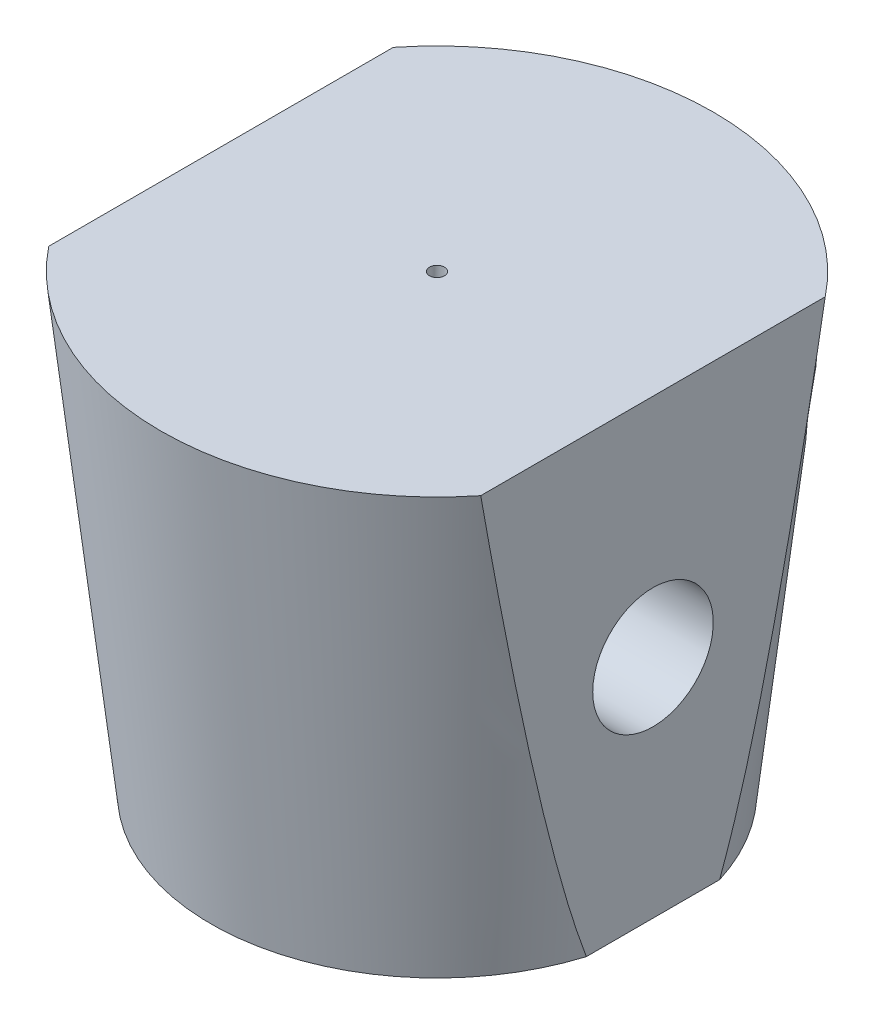
ISO-10303-21;
HEADER;
FILE_DESCRIPTION(('STEP AP214'),'2;1');
FILE_NAME('part.step','',(''),(''),'','','');
FILE_SCHEMA(('AUTOMOTIVE_DESIGN { 1 0 10303 214 1 1 1 1 }'));
ENDSEC;
DATA;
#1=APPLICATION_CONTEXT('core data for automotive mechanical design processes');
#2=APPLICATION_PROTOCOL_DEFINITION('international standard','automotive_design',2000,#1);
#3=PRODUCT_CONTEXT('',#1,'mechanical');
#4=PRODUCT('Part','Part','',(#3));
#5=PRODUCT_RELATED_PRODUCT_CATEGORY('part','',(#4));
#6=PRODUCT_DEFINITION_FORMATION('','',#4);
#7=PRODUCT_DEFINITION_CONTEXT('part definition',#1,'design');
#8=PRODUCT_DEFINITION('design','',#6,#7);
#9=PRODUCT_DEFINITION_SHAPE('','',#8);
#10=(LENGTH_UNIT() NAMED_UNIT(*) SI_UNIT(.MILLI.,.METRE.));
#11=(NAMED_UNIT(*) PLANE_ANGLE_UNIT() SI_UNIT($,.RADIAN.));
#12=(NAMED_UNIT(*) SI_UNIT($,.STERADIAN.) SOLID_ANGLE_UNIT());
#13=UNCERTAINTY_MEASURE_WITH_UNIT(LENGTH_MEASURE(1.E-05),#10,'distance_accuracy_value','');
#14=(GEOMETRIC_REPRESENTATION_CONTEXT(3) GLOBAL_UNCERTAINTY_ASSIGNED_CONTEXT((#13)) GLOBAL_UNIT_ASSIGNED_CONTEXT((#10,
#11,#12)) REPRESENTATION_CONTEXT('',''));
#15=CARTESIAN_POINT('',(0.,0.,0.));
#16=DIRECTION('',(0.,0.,1.));
#17=DIRECTION('',(1.,0.,0.));
#18=AXIS2_PLACEMENT_3D('',#15,#16,#17);
#19=CARTESIAN_POINT('',(0.,45.,0.));
#20=DIRECTION('',(0.,1.,0.));
#21=DIRECTION('',(0.,0.,1.));
#22=AXIS2_PLACEMENT_3D('',#19,#20,#21);
#23=CONICAL_SURFACE('',#22,27.5,0.110657221173896);
#24=CARTESIAN_POINT('',(0.,45.,0.));
#25=DIRECTION('',(0.,-1.,0.));
#26=DIRECTION('',(0.,0.,-1.));
#27=AXIS2_PLACEMENT_3D('',#24,#25,#26);
#28=CIRCLE('',#27,27.5);
#29=CARTESIAN_POINT('',(21.5,45.,17.1464281994822));
#30=VERTEX_POINT('',#29);
#31=CARTESIAN_POINT('',(-21.5,45.,17.1464281994823));
#32=VERTEX_POINT('',#31);
#33=EDGE_CURVE('E86',#30,#32,#28,.T.);
#34=ORIENTED_EDGE('',*,*,#33,.T.);
#35=CARTESIAN_POINT('',(-21.5,87.6382112106557,24.0210637002269));
#36=CARTESIAN_POINT('',(-21.5,85.2572334147898,23.6659770586523));
#37=CARTESIAN_POINT('',(-21.5,82.8767505940874,23.3075435711373));
#38=CARTESIAN_POINT('',(-21.5,78.1169632768771,22.5828093974586));
#39=CARTESIAN_POINT('',(-21.5,75.737658790314,22.2165086460175));
#40=CARTESIAN_POINT('',(-21.5,70.9794914143995,21.4747219094903));
#41=CARTESIAN_POINT('',(-21.5,68.6006290954569,21.0992322596051));
#42=CARTESIAN_POINT('',(-21.5,63.8446040643734,20.337671828327));
#43=CARTESIAN_POINT('',(-21.5,61.4674413469446,19.9516010800029));
#44=CARTESIAN_POINT('',(-21.5,56.6914337790499,19.1630151454632));
#45=CARTESIAN_POINT('',(-21.5,54.2926096497552,18.7603741806102));
#46=CARTESIAN_POINT('',(-21.5,49.4976016572549,17.9396912697448));
#47=CARTESIAN_POINT('',(-21.5,47.1014177843061,17.5216493807627));
#48=CARTESIAN_POINT('',(-21.5,42.3129954677123,16.6667559927095));
#49=CARTESIAN_POINT('',(-21.5,39.9207562014947,16.2299091255311));
#50=CARTESIAN_POINT('',(-21.5,36.3357800962161,15.5567124970464));
#51=CARTESIAN_POINT('',(-21.5,35.1413583509917,15.3293271858103));
#52=CARTESIAN_POINT('',(-21.5,32.7538349695034,14.8677342087056));
#53=CARTESIAN_POINT('',(-21.5,31.5607333294463,14.6335265624935));
#54=CARTESIAN_POINT('',(-21.5,29.1790419207475,14.1578769620032));
#55=CARTESIAN_POINT('',(-21.5,27.9904482945468,13.9164543522987));
#56=CARTESIAN_POINT('',(-21.5,25.6151212358601,13.4245717568391));
#57=CARTESIAN_POINT('',(-21.5,24.4283878145184,13.1741117171562));
#58=CARTESIAN_POINT('',(-21.5,22.056703425136,12.6624562079229));
#59=CARTESIAN_POINT('',(-21.5,20.871753431011,12.4012562134444));
#60=CARTESIAN_POINT('',(-21.5,18.5047394934195,11.8661500302973));
#61=CARTESIAN_POINT('',(-21.5,17.3226754949868,11.592244085643));
#62=CARTESIAN_POINT('',(-21.5,14.9648710152004,11.029552011163));
#63=CARTESIAN_POINT('',(-21.5,13.7891223097108,10.7408004412617));
#64=CARTESIAN_POINT('',(-21.5,11.4423859317125,10.1439954606998));
#65=CARTESIAN_POINT('',(-21.5,10.2713986650195,9.83594044007017));
#66=CARTESIAN_POINT('',(-21.5,8.52047663787354,9.35521021494595));
#67=CARTESIAN_POINT('',(-21.5,7.93796321316561,9.1919186324732));
#68=CARTESIAN_POINT('',(-21.5,6.77502351787516,8.85807751382204));
#69=CARTESIAN_POINT('',(-21.5,6.19459721237072,8.68752809970109));
#70=CARTESIAN_POINT('',(-21.5,5.03639346802792,8.33795664817778));
#71=CARTESIAN_POINT('',(-21.5,4.45861563606011,8.15893591604747));
#72=CARTESIAN_POINT('',(-21.5,3.30630057619273,7.79078294012616));
#73=CARTESIAN_POINT('',(-21.5,2.73176319884996,7.60165116692154));
#74=CARTESIAN_POINT('',(-21.5,1.87231382103296,7.30844627671188));
#75=CARTESIAN_POINT('',(-21.5,1.58582756663399,7.20898211605915));
#76=CARTESIAN_POINT('',(-21.5,1.0140793896436,7.00659104841672));
#77=CARTESIAN_POINT('',(-21.5,0.728817472339717,6.90366412648933));
#78=CARTESIAN_POINT('',(-21.5,-0.125005911184716,6.58902829179186));
#79=CARTESIAN_POINT('',(-21.5,-0.691447463956209,6.37151755683564));
#80=CARTESIAN_POINT('',(-21.5,-1.81646653859613,5.91662753509271));
#81=CARTESIAN_POINT('',(-21.5,-2.37504343187865,5.67924667059114));
#82=CARTESIAN_POINT('',(-21.5,-3.20365818014677,5.30311612710975));
#83=CARTESIAN_POINT('',(-21.5,-3.47826113040515,5.17442700101839));
#84=CARTESIAN_POINT('',(-21.5,-4.02356296710003,4.90905163132156));
#85=CARTESIAN_POINT('',(-21.5,-4.29426224760543,4.77236620207419));
#86=CARTESIAN_POINT('',(-21.5,-4.83194750276113,4.48863516608045));
#87=CARTESIAN_POINT('',(-21.5,-5.09890794822681,4.34154090266609));
#88=CARTESIAN_POINT('',(-21.5,-5.62605563696025,4.03523795640537));
#89=CARTESIAN_POINT('',(-21.5,-5.88623899990993,3.87602252952003));
#90=CARTESIAN_POINT('',(-21.5,-6.39694940503474,3.54225163205047));
#91=CARTESIAN_POINT('',(-21.5,-6.64746885635535,3.36768444219307));
#92=CARTESIAN_POINT('',(-21.5,-7.1335590101402,2.99897652353037));
#93=CARTESIAN_POINT('',(-21.5,-7.36914864413191,2.80486142544394));
#94=CARTESIAN_POINT('',(-21.5,-7.706168870401,2.49260013596183));
#95=CARTESIAN_POINT('',(-21.5,-7.81650105612355,2.38415603615297));
#96=CARTESIAN_POINT('',(-21.5,-8.02895452514549,2.15954051934501));
#97=CARTESIAN_POINT('',(-21.5,-8.13107135626514,2.0433649738984));
#98=CARTESIAN_POINT('',(-21.5,-8.41987369638785,1.68308542942894));
#99=CARTESIAN_POINT('',(-21.5,-8.59125842368299,1.4252772752442));
#100=CARTESIAN_POINT('',(-21.5,-8.78728574537112,1.0169005806418));
#101=CARTESIAN_POINT('',(-21.5,-8.84180050448055,0.880740134380523));
#102=CARTESIAN_POINT('',(-21.5,-8.92838683731463,0.601366408016208));
#103=CARTESIAN_POINT('',(-21.5,-8.96047999734758,0.458160053947498));
#104=CARTESIAN_POINT('',(-21.5,-8.99859084166423,0.167237180119135));
#105=CARTESIAN_POINT('',(-21.5,-9.0044342904009,0.0194970583448057));
#106=CARTESIAN_POINT('',(-21.5,-8.98875905865794,-0.27453029190973));
#107=CARTESIAN_POINT('',(-21.5,-8.96722711853391,-0.420816781705538));
#108=CARTESIAN_POINT('',(-21.5,-8.89476067765273,-0.727853760140841));
#109=CARTESIAN_POINT('',(-21.5,-8.84007813934691,-0.887700208604585));
#110=CARTESIAN_POINT('',(-21.5,-8.70563440561772,-1.19641048321508));
#111=CARTESIAN_POINT('',(-21.5,-8.62582221374731,-1.345251209845));
#112=CARTESIAN_POINT('',(-21.5,-8.38927172572083,-1.72596742376234));
#113=CARTESIAN_POINT('',(-21.5,-8.21653244162468,-1.94779467388692));
#114=CARTESIAN_POINT('',(-21.5,-7.93582495617918,-2.26032305694987));
#115=CARTESIAN_POINT('',(-21.5,-7.83846211336719,-2.36129309486593));
#116=CARTESIAN_POINT('',(-21.5,-7.63795314187323,-2.55733247243517));
#117=CARTESIAN_POINT('',(-21.5,-7.53480881248657,-2.6524036287244));
#118=CARTESIAN_POINT('',(-21.5,-7.26854739054979,-2.88602808355682));
#119=CARTESIAN_POINT('',(-21.5,-7.10243119371599,-3.02113858943443));
#120=CARTESIAN_POINT('',(-21.5,-6.76259092096405,-3.28148767682195));
#121=CARTESIAN_POINT('',(-21.5,-6.5888629667284,-3.40672113264337));
#122=CARTESIAN_POINT('',(-21.5,-6.05868548093046,-3.77061273249275));
#123=CARTESIAN_POINT('',(-21.5,-5.69382260342359,-3.99697961488263));
#124=CARTESIAN_POINT('',(-21.5,-4.94854372235883,-4.42766312534499));
#125=CARTESIAN_POINT('',(-21.5,-4.56804335441067,-4.63182988848292));
#126=CARTESIAN_POINT('',(-21.5,-3.99081224147547,-4.92458495946411));
#127=CARTESIAN_POINT('',(-21.5,-3.79743805726465,-5.01986843145478));
#128=CARTESIAN_POINT('',(-21.5,-3.40880897437414,-5.20650144235805));
#129=CARTESIAN_POINT('',(-21.5,-3.21355413638091,-5.29785110769297));
#130=CARTESIAN_POINT('',(-21.5,-2.57179169878322,-5.59123280761468));
#131=CARTESIAN_POINT('',(-21.5,-2.12198717407836,-5.78606341815419));
#132=CARTESIAN_POINT('',(-21.5,-1.21658123325474,-6.1618201311867));
#133=CARTESIAN_POINT('',(-21.5,-0.760978830225604,-6.3427438285347));
#134=CARTESIAN_POINT('',(-21.5,0.154761469428687,-6.69345053302129));
#135=CARTESIAN_POINT('',(-21.5,0.614901683729249,-6.86322746760971));
#136=CARTESIAN_POINT('',(-21.5,1.53851234655046,-7.19349297564485));
#137=CARTESIAN_POINT('',(-21.5,2.00198296205984,-7.35398107963784));
#138=CARTESIAN_POINT('',(-21.5,3.3984964428189,-7.82453522579346));
#139=CARTESIAN_POINT('',(-21.5,4.33548775567178,-8.12288448872531));
#140=CARTESIAN_POINT('',(-21.5,6.21611042250392,-8.69646458679509));
#141=CARTESIAN_POINT('',(-21.5,7.15973962943591,-8.971702555495));
#142=CARTESIAN_POINT('',(-21.5,9.05285946260708,-9.50452629454244));
#143=CARTESIAN_POINT('',(-21.5,10.0023545729771,-9.76209607164893));
#144=CARTESIAN_POINT('',(-21.5,11.90517552557,-10.2629004231476));
#145=CARTESIAN_POINT('',(-21.5,12.8585016516036,-10.5061339137526));
#146=CARTESIAN_POINT('',(-21.5,14.7667029784512,-10.9804590044194));
#147=CARTESIAN_POINT('',(-21.5,15.7215739697347,-11.2115675898841));
#148=CARTESIAN_POINT('',(-21.5,17.6336189639825,-11.6639072228306));
#149=CARTESIAN_POINT('',(-21.5,18.5907929054699,-11.8851385309682));
#150=CARTESIAN_POINT('',(-21.5,20.9696967086104,-12.4240103966261));
#151=CARTESIAN_POINT('',(-21.5,22.3925655823738,-12.736620235845));
#152=CARTESIAN_POINT('',(-21.5,25.241500246998,-13.3469580514584));
#153=CARTESIAN_POINT('',(-21.5,26.6675660896388,-13.6446857849664));
#154=CARTESIAN_POINT('',(-21.5,29.5222981402983,-14.2278394870712));
#155=CARTESIAN_POINT('',(-21.5,30.9509645050741,-14.5132646866388));
#156=CARTESIAN_POINT('',(-21.5,33.8103313177729,-15.0737434429819));
#157=CARTESIAN_POINT('',(-21.5,35.2410317735959,-15.3487969593616));
#158=CARTESIAN_POINT('',(-21.5,38.105447874308,-15.890295872046));
#159=CARTESIAN_POINT('',(-21.5,39.5391650885829,-16.1567329538141));
#160=CARTESIAN_POINT('',(-21.5,42.4080059183756,-16.681919999697));
#161=CARTESIAN_POINT('',(-21.5,43.8431295356266,-16.9406699543255));
#162=CARTESIAN_POINT('',(-21.5,48.1501778465459,-17.7068691562509));
#163=CARTESIAN_POINT('',(-21.5,51.0238883020426,-18.2042880506219));
#164=CARTESIAN_POINT('',(-21.5,56.7078813819838,-19.1668692325449));
#165=CARTESIAN_POINT('',(-21.5,59.5180829273593,-19.6325129055326));
#166=CARTESIAN_POINT('',(-21.5,65.1411495290778,-20.5476220004807));
#167=CARTESIAN_POINT('',(-21.5,67.9540146174107,-20.9970872255376));
#168=CARTESIAN_POINT('',(-21.5,73.5778296397256,-21.8820217367932));
#169=CARTESIAN_POINT('',(-21.5,76.3887765812555,-22.3175100746511));
#170=CARTESIAN_POINT('',(-21.5,80.606447569448,-22.9623340545733));
#171=CARTESIAN_POINT('',(-21.5,82.012531079576,-23.1758716909146));
#172=CARTESIAN_POINT('',(-21.5,84.825087661411,-23.6003571311007));
#173=CARTESIAN_POINT('',(-21.5,86.231560732744,-23.8113049374226));
#174=CARTESIAN_POINT('',(-21.5,87.6382112106557,-24.0210637002269));
#175=B_SPLINE_CURVE_WITH_KNOTS('',3,(#35,#36,#37,#38,#39,#40,#41,#42,#43,#44,#45,#46,#47,#48,
#49,#50,#51,#52,#53,#54,#55,#56,#57,#58,#59,#60,#61,#62,#63,#64,#65,#66,#67,#68,#69,#70,#71,#72,
#73,#74,#75,#76,#77,#78,#79,#80,#81,#82,#83,#84,#85,#86,#87,#88,#89,#90,#91,#92,#93,#94,#95,#96,
#97,#98,#99,#100,#101,#102,#103,#104,#105,#106,#107,#108,#109,#110,#111,#112,#113,#114,#115,
#116,#117,#118,#119,#120,#121,#122,#123,#124,#125,#126,#127,#128,#129,#130,#131,#132,#133,#134,
#135,#136,#137,#138,#139,#140,#141,#142,#143,#144,#145,#146,#147,#148,#149,#150,#151,#152,#153,
#154,#155,#156,#157,#158,#159,#160,#161,#162,#163,#164,#165,#166,#167,#168,#169,#170,#171,#172,
#173,#174),.UNSPECIFIED.,.F.,.F.,(4,2,2,2,2,2,2,2,2,2,2,2,2,2,2,2,2,2,2,2,2,2,2,2,2,2,2,2,2,2,2,
2,2,2,2,2,2,2,2,2,2,2,2,2,2,2,2,2,2,2,2,2,2,2,2,2,2,2,2,2,2,2,2,2,2,2,2,2,2,4),(0.,
7.2219339429217,14.4439278319715,21.6688505790683,28.8937507488577,36.1908513436038,
43.4879249195067,50.7832113090113,54.4308148033299,58.0784077892902,61.7169708129084,
65.3555555520292,68.9956893211478,72.6357532114343,76.2676963672728,79.8999428429358,
81.7148094824827,83.5296456128444,85.3442030155959,87.1586760389186,88.0684410226733,
88.9782099314804,90.7982464938409,92.6184277068706,93.5281127204886,94.4377052508625,
95.3518733596176,96.2665538686308,97.1819387930324,98.0961387404413,98.5598339512097,
99.0237787847169,99.9428110186019,100.38132292471,100.819412071224,101.260404830097,
101.70161127125,102.205602520128,102.710623199821,103.549029454249,103.969742790747,
104.390325913449,105.032213792948,105.674432617404,106.961124142083,108.256023220335,
108.902708265454,109.549372512261,111.019586622943,112.490054431839,113.961316788874,
115.432653438102,118.38222071398,121.330874200098,124.282162514128,127.233673652693,
130.180933209359,133.128114943466,137.498422441161,141.86880124208,146.239452839553,
150.610121458153,154.984888861345,159.359661662936,168.108876709311,176.654379268245,
185.199985797057,193.733401298808,198.000016551301,202.266627722621),.UNSPECIFIED.);
#176=CARTESIAN_POINT('',(-21.5,0.,6.6332495807108));
#177=VERTEX_POINT('',#176);
#178=EDGE_CURVE('E48',#32,#177,#175,.T.);
#179=ORIENTED_EDGE('',*,*,#178,.T.);
#180=CARTESIAN_POINT('',(0.,0.,0.));
#181=DIRECTION('',(0.,-1.,0.));
#182=DIRECTION('',(0.,0.,-1.));
#183=AXIS2_PLACEMENT_3D('',#180,#181,#182);
#184=CIRCLE('',#183,22.5);
#185=CARTESIAN_POINT('',(21.5,0.,6.63324958071079));
#186=VERTEX_POINT('',#185);
#187=EDGE_CURVE('E41',#186,#177,#184,.T.);
#188=ORIENTED_EDGE('',*,*,#187,.F.);
#189=CARTESIAN_POINT('',(21.5,87.6382112106557,-24.0210637002269));
#190=CARTESIAN_POINT('',(21.5,85.2572334147898,-23.6659770586523));
#191=CARTESIAN_POINT('',(21.5,82.8767505940874,-23.3075435711373));
#192=CARTESIAN_POINT('',(21.5,78.1169632768771,-22.5828093974586));
#193=CARTESIAN_POINT('',(21.5,75.737658790314,-22.2165086460175));
#194=CARTESIAN_POINT('',(21.5,70.9794914143995,-21.4747219094903));
#195=CARTESIAN_POINT('',(21.5,68.6006290954569,-21.0992322596051));
#196=CARTESIAN_POINT('',(21.5,63.8446040643734,-20.337671828327));
#197=CARTESIAN_POINT('',(21.5,61.4674413469446,-19.9516010800029));
#198=CARTESIAN_POINT('',(21.5,56.6914337790499,-19.1630151454632));
#199=CARTESIAN_POINT('',(21.5,54.2926096497552,-18.7603741806102));
#200=CARTESIAN_POINT('',(21.5,49.4976016572549,-17.9396912697448));
#201=CARTESIAN_POINT('',(21.5,47.1014177843061,-17.5216493807627));
#202=CARTESIAN_POINT('',(21.5,42.3129954677123,-16.6667559927095));
#203=CARTESIAN_POINT('',(21.5,39.9207562014947,-16.2299091255311));
#204=CARTESIAN_POINT('',(21.5,36.3357800962161,-15.5567124970464));
#205=CARTESIAN_POINT('',(21.5,35.1413583509917,-15.3293271858103));
#206=CARTESIAN_POINT('',(21.5,32.7538349695034,-14.8677342087056));
#207=CARTESIAN_POINT('',(21.5,31.5607333294463,-14.6335265624935));
#208=CARTESIAN_POINT('',(21.5,29.1790419207475,-14.1578769620032));
#209=CARTESIAN_POINT('',(21.5,27.9904482945468,-13.9164543522987));
#210=CARTESIAN_POINT('',(21.5,25.6151212358601,-13.4245717568391));
#211=CARTESIAN_POINT('',(21.5,24.4283878145184,-13.1741117171562));
#212=CARTESIAN_POINT('',(21.5,22.056703425136,-12.6624562079229));
#213=CARTESIAN_POINT('',(21.5,20.871753431011,-12.4012562134444));
#214=CARTESIAN_POINT('',(21.5,18.5047394934195,-11.8661500302973));
#215=CARTESIAN_POINT('',(21.5,17.3226754949868,-11.592244085643));
#216=CARTESIAN_POINT('',(21.5,14.9648710152004,-11.029552011163));
#217=CARTESIAN_POINT('',(21.5,13.7891223097108,-10.7408004412617));
#218=CARTESIAN_POINT('',(21.5,11.4423859317125,-10.1439954606998));
#219=CARTESIAN_POINT('',(21.5,10.2713986650195,-9.83594044007017));
#220=CARTESIAN_POINT('',(21.5,8.52047663787354,-9.35521021494595));
#221=CARTESIAN_POINT('',(21.5,7.93796321316561,-9.1919186324732));
#222=CARTESIAN_POINT('',(21.5,6.77502351787516,-8.85807751382204));
#223=CARTESIAN_POINT('',(21.5,6.19459721237072,-8.68752809970109));
#224=CARTESIAN_POINT('',(21.5,5.03639346802792,-8.33795664817778));
#225=CARTESIAN_POINT('',(21.5,4.45861563606011,-8.15893591604747));
#226=CARTESIAN_POINT('',(21.5,3.30630057619273,-7.79078294012616));
#227=CARTESIAN_POINT('',(21.5,2.73176319884996,-7.60165116692154));
#228=CARTESIAN_POINT('',(21.5,1.87231382103296,-7.30844627671188));
#229=CARTESIAN_POINT('',(21.5,1.58582756663399,-7.20898211605915));
#230=CARTESIAN_POINT('',(21.5,1.0140793896436,-7.00659104841672));
#231=CARTESIAN_POINT('',(21.5,0.728817472339717,-6.90366412648933));
#232=CARTESIAN_POINT('',(21.5,-0.125005911184716,-6.58902829179186));
#233=CARTESIAN_POINT('',(21.5,-0.691447463956209,-6.37151755683564));
#234=CARTESIAN_POINT('',(21.5,-1.81646653859613,-5.91662753509271));
#235=CARTESIAN_POINT('',(21.5,-2.37504343187865,-5.67924667059114));
#236=CARTESIAN_POINT('',(21.5,-3.20365818014677,-5.30311612710975));
#237=CARTESIAN_POINT('',(21.5,-3.47826113040515,-5.17442700101839));
#238=CARTESIAN_POINT('',(21.5,-4.02356296710003,-4.90905163132156));
#239=CARTESIAN_POINT('',(21.5,-4.29426224760543,-4.77236620207419));
#240=CARTESIAN_POINT('',(21.5,-4.83194750276113,-4.48863516608045));
#241=CARTESIAN_POINT('',(21.5,-5.09890794822681,-4.34154090266609));
#242=CARTESIAN_POINT('',(21.5,-5.62605563696025,-4.03523795640537));
#243=CARTESIAN_POINT('',(21.5,-5.88623899990993,-3.87602252952003));
#244=CARTESIAN_POINT('',(21.5,-6.39694940503474,-3.54225163205047));
#245=CARTESIAN_POINT('',(21.5,-6.64746885635535,-3.36768444219307));
#246=CARTESIAN_POINT('',(21.5,-7.1335590101402,-2.99897652353037));
#247=CARTESIAN_POINT('',(21.5,-7.36914864413191,-2.80486142544394));
#248=CARTESIAN_POINT('',(21.5,-7.706168870401,-2.49260013596183));
#249=CARTESIAN_POINT('',(21.5,-7.81650105612355,-2.38415603615297));
#250=CARTESIAN_POINT('',(21.5,-8.02895452514549,-2.15954051934501));
#251=CARTESIAN_POINT('',(21.5,-8.13107135626514,-2.0433649738984));
#252=CARTESIAN_POINT('',(21.5,-8.41987369638785,-1.68308542942894));
#253=CARTESIAN_POINT('',(21.5,-8.59125842368299,-1.4252772752442));
#254=CARTESIAN_POINT('',(21.5,-8.78728574537112,-1.0169005806418));
#255=CARTESIAN_POINT('',(21.5,-8.84180050448055,-0.880740134380523));
#256=CARTESIAN_POINT('',(21.5,-8.92838683731463,-0.601366408016208));
#257=CARTESIAN_POINT('',(21.5,-8.96047999734758,-0.458160053947498));
#258=CARTESIAN_POINT('',(21.5,-8.99859084166423,-0.167237180119135));
#259=CARTESIAN_POINT('',(21.5,-9.0044342904009,-0.0194970583448057));
#260=CARTESIAN_POINT('',(21.5,-8.98875905865794,0.27453029190973));
#261=CARTESIAN_POINT('',(21.5,-8.96722711853391,0.420816781705538));
#262=CARTESIAN_POINT('',(21.5,-8.89476067765273,0.727853760140841));
#263=CARTESIAN_POINT('',(21.5,-8.84007813934691,0.887700208604585));
#264=CARTESIAN_POINT('',(21.5,-8.70563440561772,1.19641048321508));
#265=CARTESIAN_POINT('',(21.5,-8.62582221374731,1.345251209845));
#266=CARTESIAN_POINT('',(21.5,-8.38927172572083,1.72596742376234));
#267=CARTESIAN_POINT('',(21.5,-8.21653244162468,1.94779467388692));
#268=CARTESIAN_POINT('',(21.5,-7.93582495617918,2.26032305694987));
#269=CARTESIAN_POINT('',(21.5,-7.83846211336719,2.36129309486593));
#270=CARTESIAN_POINT('',(21.5,-7.63795314187323,2.55733247243517));
#271=CARTESIAN_POINT('',(21.5,-7.53480881248657,2.6524036287244));
#272=CARTESIAN_POINT('',(21.5,-7.26854739054979,2.88602808355682));
#273=CARTESIAN_POINT('',(21.5,-7.10243119371599,3.02113858943443));
#274=CARTESIAN_POINT('',(21.5,-6.76259092096405,3.28148767682195));
#275=CARTESIAN_POINT('',(21.5,-6.5888629667284,3.40672113264337));
#276=CARTESIAN_POINT('',(21.5,-6.05868548093046,3.77061273249275));
#277=CARTESIAN_POINT('',(21.5,-5.69382260342359,3.99697961488263));
#278=CARTESIAN_POINT('',(21.5,-4.94854372235883,4.42766312534499));
#279=CARTESIAN_POINT('',(21.5,-4.56804335441067,4.63182988848292));
#280=CARTESIAN_POINT('',(21.5,-3.99081224147547,4.92458495946411));
#281=CARTESIAN_POINT('',(21.5,-3.79743805726465,5.01986843145478));
#282=CARTESIAN_POINT('',(21.5,-3.40880897437414,5.20650144235805));
#283=CARTESIAN_POINT('',(21.5,-3.21355413638091,5.29785110769297));
#284=CARTESIAN_POINT('',(21.5,-2.57179169878322,5.59123280761468));
#285=CARTESIAN_POINT('',(21.5,-2.12198717407836,5.78606341815419));
#286=CARTESIAN_POINT('',(21.5,-1.21658123325474,6.1618201311867));
#287=CARTESIAN_POINT('',(21.5,-0.760978830225604,6.3427438285347));
#288=CARTESIAN_POINT('',(21.5,0.154761469428687,6.69345053302129));
#289=CARTESIAN_POINT('',(21.5,0.614901683729249,6.86322746760971));
#290=CARTESIAN_POINT('',(21.5,1.53851234655046,7.19349297564485));
#291=CARTESIAN_POINT('',(21.5,2.00198296205984,7.35398107963784));
#292=CARTESIAN_POINT('',(21.5,3.3984964428189,7.82453522579346));
#293=CARTESIAN_POINT('',(21.5,4.33548775567178,8.12288448872531));
#294=CARTESIAN_POINT('',(21.5,6.21611042250392,8.69646458679509));
#295=CARTESIAN_POINT('',(21.5,7.15973962943591,8.971702555495));
#296=CARTESIAN_POINT('',(21.5,9.05285946260708,9.50452629454244));
#297=CARTESIAN_POINT('',(21.5,10.0023545729771,9.76209607164893));
#298=CARTESIAN_POINT('',(21.5,11.90517552557,10.2629004231476));
#299=CARTESIAN_POINT('',(21.5,12.8585016516036,10.5061339137526));
#300=CARTESIAN_POINT('',(21.5,14.7667029784512,10.9804590044194));
#301=CARTESIAN_POINT('',(21.5,15.7215739697347,11.2115675898841));
#302=CARTESIAN_POINT('',(21.5,17.6336189639825,11.6639072228306));
#303=CARTESIAN_POINT('',(21.5,18.5907929054699,11.8851385309682));
#304=CARTESIAN_POINT('',(21.5,20.9696967086104,12.4240103966261));
#305=CARTESIAN_POINT('',(21.5,22.3925655823738,12.736620235845));
#306=CARTESIAN_POINT('',(21.5,25.241500246998,13.3469580514584));
#307=CARTESIAN_POINT('',(21.5,26.6675660896388,13.6446857849664));
#308=CARTESIAN_POINT('',(21.5,29.5222981402983,14.2278394870712));
#309=CARTESIAN_POINT('',(21.5,30.9509645050741,14.5132646866388));
#310=CARTESIAN_POINT('',(21.5,33.8103313177729,15.0737434429819));
#311=CARTESIAN_POINT('',(21.5,35.2410317735959,15.3487969593616));
#312=CARTESIAN_POINT('',(21.5,38.105447874308,15.890295872046));
#313=CARTESIAN_POINT('',(21.5,39.5391650885829,16.1567329538141));
#314=CARTESIAN_POINT('',(21.5,42.4080059183756,16.681919999697));
#315=CARTESIAN_POINT('',(21.5,43.8431295356266,16.9406699543255));
#316=CARTESIAN_POINT('',(21.5,48.1501778465459,17.7068691562509));
#317=CARTESIAN_POINT('',(21.5,51.0238883020426,18.2042880506219));
#318=CARTESIAN_POINT('',(21.5,56.7078813819838,19.1668692325449));
#319=CARTESIAN_POINT('',(21.5,59.5180829273593,19.6325129055326));
#320=CARTESIAN_POINT('',(21.5,65.1411495290778,20.5476220004807));
#321=CARTESIAN_POINT('',(21.5,67.9540146174107,20.9970872255376));
#322=CARTESIAN_POINT('',(21.5,73.5778296397256,21.8820217367932));
#323=CARTESIAN_POINT('',(21.5,76.3887765812555,22.3175100746511));
#324=CARTESIAN_POINT('',(21.5,80.606447569448,22.9623340545733));
#325=CARTESIAN_POINT('',(21.5,82.012531079576,23.1758716909146));
#326=CARTESIAN_POINT('',(21.5,84.825087661411,23.6003571311007));
#327=CARTESIAN_POINT('',(21.5,86.231560732744,23.8113049374226));
#328=CARTESIAN_POINT('',(21.5,87.6382112106557,24.0210637002269));
#329=B_SPLINE_CURVE_WITH_KNOTS('',3,(#189,#190,#191,#192,#193,#194,#195,#196,#197,#198,#199,
#200,#201,#202,#203,#204,#205,#206,#207,#208,#209,#210,#211,#212,#213,#214,#215,#216,#217,#218,
#219,#220,#221,#222,#223,#224,#225,#226,#227,#228,#229,#230,#231,#232,#233,#234,#235,#236,#237,
#238,#239,#240,#241,#242,#243,#244,#245,#246,#247,#248,#249,#250,#251,#252,#253,#254,#255,#256,
#257,#258,#259,#260,#261,#262,#263,#264,#265,#266,#267,#268,#269,#270,#271,#272,#273,#274,#275,
#276,#277,#278,#279,#280,#281,#282,#283,#284,#285,#286,#287,#288,#289,#290,#291,#292,#293,#294,
#295,#296,#297,#298,#299,#300,#301,#302,#303,#304,#305,#306,#307,#308,#309,#310,#311,#312,#313,
#314,#315,#316,#317,#318,#319,#320,#321,#322,#323,#324,#325,#326,#327,#328),.UNSPECIFIED.,.F.,
.F.,(4,2,2,2,2,2,2,2,2,2,2,2,2,2,2,2,2,2,2,2,2,2,2,2,2,2,2,2,2,2,2,2,2,2,2,2,2,2,2,2,2,2,2,2,2,
2,2,2,2,2,2,2,2,2,2,2,2,2,2,2,2,2,2,2,2,2,2,2,2,4),(0.,7.2219339429217,14.4439278319715,
21.6688505790683,28.8937507488577,36.1908513436038,43.4879249195067,50.7832113090113,
54.4308148033299,58.0784077892902,61.7169708129084,65.3555555520292,68.9956893211478,
72.6357532114343,76.2676963672728,79.8999428429358,81.7148094824827,83.5296456128444,
85.3442030155959,87.1586760389186,88.0684410226733,88.9782099314804,90.7982464938409,
92.6184277068706,93.5281127204886,94.4377052508625,95.3518733596176,96.2665538686308,
97.1819387930324,98.0961387404413,98.5598339512097,99.0237787847169,99.9428110186019,
100.38132292471,100.819412071224,101.260404830097,101.70161127125,102.205602520128,
102.710623199821,103.549029454249,103.969742790747,104.390325913449,105.032213792948,
105.674432617404,106.961124142083,108.256023220335,108.902708265454,109.549372512261,
111.019586622943,112.490054431839,113.961316788874,115.432653438102,118.38222071398,
121.330874200098,124.282162514128,127.233673652693,130.180933209359,133.128114943466,
137.498422441161,141.86880124208,146.239452839553,150.610121458153,154.984888861345,
159.359661662936,168.108876709311,176.654379268245,185.199985797057,193.733401298808,
198.000016551301,202.266627722621),.UNSPECIFIED.);
#330=EDGE_CURVE('E132',#186,#30,#329,.T.);
#331=ORIENTED_EDGE('',*,*,#330,.T.);
#332=EDGE_LOOP('',(#34,#179,#188,#331));
#333=FACE_BOUND('',#332,.T.);
#334=ADVANCED_FACE('F33',(#333),#23,.T.);
#335=CARTESIAN_POINT('',(0.,0.,0.));
#336=DIRECTION('',(0.,1.,0.));
#337=DIRECTION('',(0.,0.,1.));
#338=AXIS2_PLACEMENT_3D('',#335,#336,#337);
#339=CYLINDRICAL_SURFACE('',#338,0.75);
#340=CARTESIAN_POINT('',(0.,45.,0.));
#341=DIRECTION('',(0.,1.,0.));
#342=DIRECTION('',(0.,0.,1.));
#343=AXIS2_PLACEMENT_3D('',#340,#341,#342);
#344=CIRCLE('',#343,0.75);
#345=CARTESIAN_POINT('',(0.,45.,0.75));
#346=VERTEX_POINT('',#345);
#347=EDGE_CURVE('E87',#346,#346,#344,.T.);
#348=ORIENTED_EDGE('',*,*,#347,.T.);
#349=EDGE_LOOP('',(#348));
#350=FACE_BOUND('',#349,.T.);
#351=CARTESIAN_POINT('',(0.,28.4529404498953,0.75));
#352=CARTESIAN_POINT('',(0.0419508851375487,28.452941052514,0.749998216450184));
#353=CARTESIAN_POINT('',(0.0839279894714444,28.4533886853568,0.746468369706385));
#354=CARTESIAN_POINT('',(0.166713967621382,28.4551301729399,0.732442924116402));
#355=CARTESIAN_POINT('',(0.207521574149112,28.4564249119289,0.721940046327388));
#356=CARTESIAN_POINT('',(0.286757964634809,28.4597117213263,0.694283007847788));
#357=CARTESIAN_POINT('',(0.325188342635598,28.461703318361,0.677133361439472));
#358=CARTESIAN_POINT('',(0.398618535546923,28.4661588705597,0.636679259528859));
#359=CARTESIAN_POINT('',(0.433618935522916,28.4686227449529,0.613375856212437));
#360=CARTESIAN_POINT('',(0.499398674136638,28.4737606777317,0.561136035079326));
#361=CARTESIAN_POINT('',(0.530156040695665,28.4764357251061,0.532172044507289));
#362=CARTESIAN_POINT('',(0.586386830681722,28.4816856986275,0.469492578201369));
#363=CARTESIAN_POINT('',(0.611859991228406,28.4842606197882,0.43577686621741));
#364=CARTESIAN_POINT('',(0.656878073851909,28.4890303338385,0.364412949202792));
#365=CARTESIAN_POINT('',(0.676403113529898,28.4912238415404,0.326752108668335));
#366=CARTESIAN_POINT('',(0.70884335998229,28.4949727108636,0.248654015416775));
#367=CARTESIAN_POINT('',(0.721758812077955,28.4965280961689,0.208216865808272));
#368=CARTESIAN_POINT('',(0.740547620500328,28.4988185061187,0.125938706325334));
#369=CARTESIAN_POINT('',(0.746457503557168,28.4995577845078,0.0841061578990137));
#370=CARTESIAN_POINT('',(0.751180615510962,28.5001472091877,3.69602059642303E-05));
#371=CARTESIAN_POINT('',(0.749994123585762,28.4999973904562,-0.0421996730984311));
#372=CARTESIAN_POINT('',(0.740587439172772,28.49882894331,-0.125629580692364));
#373=CARTESIAN_POINT('',(0.732406530455587,28.4978151673672,-0.166827361729336));
#374=CARTESIAN_POINT('',(0.70930464701102,28.495038167827,-0.247260649171613));
#375=CARTESIAN_POINT('',(0.694383544149951,28.4932749299821,-0.286496118256862));
#376=CARTESIAN_POINT('',(0.658183052164865,28.4891887734237,-0.362012644631592));
#377=CARTESIAN_POINT('',(0.636886662680946,28.4868643615297,-0.398285468352156));
#378=CARTESIAN_POINT('',(0.588552491335191,28.4819159071959,-0.466757235691943));
#379=CARTESIAN_POINT('',(0.561514446159428,28.4792918510168,-0.498955992365207));
#380=CARTESIAN_POINT('',(0.502244454420485,28.4740166025705,-0.558596409231884));
#381=CARTESIAN_POINT('',(0.469978272136,28.4713653474142,-0.586004051998799));
#382=CARTESIAN_POINT('',(0.401285532965264,28.4663522158217,-0.635019855187532));
#383=CARTESIAN_POINT('',(0.364858963038582,28.4639903402927,-0.656627997430529));
#384=CARTESIAN_POINT('',(0.288849151331302,28.4598234078382,-0.69343337207482));
#385=CARTESIAN_POINT('',(0.24926457601404,28.4580185877244,-0.708627878958698));
#386=CARTESIAN_POINT('',(0.168078163941951,28.4551747274879,-0.732144496340426));
#387=CARTESIAN_POINT('',(0.126476424507384,28.4541356504601,-0.740466938039886));
#388=CARTESIAN_POINT('',(0.0427370454000704,28.4529476663522,-0.749958129572583));
#389=CARTESIAN_POINT('',(0.000604913073361687,28.4527928023271,-0.751174752599485));
#390=CARTESIAN_POINT('',(-0.0832625788996244,28.4533750233589,-0.746546085969167));
#391=CARTESIAN_POINT('',(-0.124997946983795,28.4541120894044,-0.740700946832943));
#392=CARTESIAN_POINT('',(-0.206743729073359,28.456389685452,-0.722154985739318));
#393=CARTESIAN_POINT('',(-0.246759484557121,28.457927498084,-0.709477345123818));
#394=CARTESIAN_POINT('',(-0.324097246455946,28.4616311099124,-0.677650115734839));
#395=CARTESIAN_POINT('',(-0.361419158172261,28.4637969311723,-0.658500299574368));
#396=CARTESIAN_POINT('',(-0.432526393143898,28.4685267940597,-0.614154606646476));
#397=CARTESIAN_POINT('',(-0.466291999594327,28.4710928782113,-0.588927335873132));
#398=CARTESIAN_POINT('',(-0.529126966180509,28.4763277186531,-0.533187222710687));
#399=CARTESIAN_POINT('',(-0.558196143560395,28.4789964789339,-0.502674174727645));
#400=CARTESIAN_POINT('',(-0.610981256200322,28.4841542660609,-0.437019532667557));
#401=CARTESIAN_POINT('',(-0.634665734038498,28.4866421817376,-0.40185254763511));
#402=CARTESIAN_POINT('',(-0.675791465290138,28.4911413390948,-0.328011774504537));
#403=CARTESIAN_POINT('',(-0.693232844544292,28.4931525903832,-0.289338057110497));
#404=CARTESIAN_POINT('',(-0.721325336072409,28.4964668719596,-0.209686157741837));
#405=CARTESIAN_POINT('',(-0.731994628809483,28.4977717970631,-0.168714469953534));
#406=CARTESIAN_POINT('',(-0.746299226768027,28.4995342640327,-0.0855438171833881));
#407=CARTESIAN_POINT('',(-0.74993484917977,28.4999918441105,-0.0433449076314323));
#408=CARTESIAN_POINT('',(-0.750062976687646,28.500007884041,0.040775155003135));
#409=CARTESIAN_POINT('',(-0.746603988170391,28.4995724495035,0.0826962413144201));
#410=CARTESIAN_POINT('',(-0.73274381597075,28.4978635234738,0.165356322435784));
#411=CARTESIAN_POINT('',(-0.722342637116473,28.4965900325644,0.206095318067955));
#412=CARTESIAN_POINT('',(-0.694908565695091,28.4933474556361,0.285228432896195));
#413=CARTESIAN_POINT('',(-0.677877996188033,28.4913786133034,0.323623368047872));
#414=CARTESIAN_POINT('',(-0.637673605617734,28.4869633428189,0.397018001143208));
#415=CARTESIAN_POINT('',(-0.614499711521492,28.4845169089894,0.432017658716409));
#416=CARTESIAN_POINT('',(-0.562487035399085,28.4793995817767,0.497876030388767));
#417=CARTESIAN_POINT('',(-0.533612161942904,28.4767273238368,0.52870613635029));
#418=CARTESIAN_POINT('',(-0.47109211679134,28.4714704770406,0.585102335645804));
#419=CARTESIAN_POINT('',(-0.437445816752728,28.468885909101,0.610667180338047));
#420=CARTESIAN_POINT('',(-0.36618902319079,28.4640864341841,0.655891572754811));
#421=CARTESIAN_POINT('',(-0.328563723019472,28.4618729932569,0.675527934950021));
#422=CARTESIAN_POINT('',(-0.250542977821572,28.4580835743589,0.708175586503006));
#423=CARTESIAN_POINT('',(-0.210150600208981,28.4565069034616,0.721194081368494));
#424=CARTESIAN_POINT('',(-0.14129100388694,28.4545523604595,0.737119768871393));
#425=CARTESIAN_POINT('',(-0.113258114538727,28.4539509045657,0.741942909303174));
#426=CARTESIAN_POINT('',(-0.0568208250099213,28.4531447466897,0.748383616771653));
#427=CARTESIAN_POINT('',(-0.0284164276497139,28.4529400416973,0.750001208129796));
#428=CARTESIAN_POINT('',(0.,28.4529404498953,0.75));
#429=B_SPLINE_CURVE_WITH_KNOTS('',3,(#351,#352,#353,#354,#355,#356,#357,#358,#359,#360,#361,
#362,#363,#364,#365,#366,#367,#368,#369,#370,#371,#372,#373,#374,#375,#376,#377,#378,#379,#380,
#381,#382,#383,#384,#385,#386,#387,#388,#389,#390,#391,#392,#393,#394,#395,#396,#397,#398,#399,
#400,#401,#402,#403,#404,#405,#406,#407,#408,#409,#410,#411,#412,#413,#414,#415,#416,#417,#418,
#419,#420,#421,#422,#423,#424,#425,#426,#427,#428),.UNSPECIFIED.,.T.,.F.,(4,2,2,2,2,2,2,2,2,2,2,
2,2,2,2,2,2,2,2,2,2,2,2,2,2,2,2,2,2,2,2,2,2,2,2,2,2,2,4),(0.,0.125748845243771,
0.251629162845714,0.37742413577436,0.503197613851838,0.629599732647197,0.756008138227736,
0.882834558437222,1.00965627101949,1.13581379082437,1.26196634751033,1.38741499479912,
1.51286602701537,1.63865461323841,1.76444896940731,1.89110309213331,2.01775761185828,
2.14446590021703,2.27116808146857,2.39701565341765,2.52286054298135,2.6482811288782,
2.77370612163556,2.89979345863233,3.02588570098443,3.15269665767703,3.27950505812663,
3.40597157035482,3.53243237931843,3.65803144886476,3.78363043106036,3.90918544063227,
4.03474194289274,4.16112038667251,4.28752876631949,4.4144252931145,4.54118335794605,
4.62636296889885,4.71154193356642),.UNSPECIFIED.);
#430=CARTESIAN_POINT('',(0.,28.4529404498953,0.75));
#431=VERTEX_POINT('',#430);
#432=EDGE_CURVE('E102',#431,#431,#429,.T.);
#433=ORIENTED_EDGE('',*,*,#432,.F.);
#434=EDGE_LOOP('',(#433));
#435=FACE_BOUND('',#434,.T.);
#436=ADVANCED_FACE('F122',(#350,#435),#339,.F.);
#437=CARTESIAN_POINT('',(-21.5,0.,-6.6332495807108));
#438=VERTEX_POINT('',#437);
#439=CARTESIAN_POINT('',(21.5,0.,-6.63324958071081));
#440=VERTEX_POINT('',#439);
#441=EDGE_CURVE('E80',#438,#440,#184,.T.);
#442=ORIENTED_EDGE('',*,*,#441,.F.);
#443=CARTESIAN_POINT('',(-21.5,45.,-17.1464281994822));
#444=VERTEX_POINT('',#443);
#445=EDGE_CURVE('E73',#438,#444,#175,.T.);
#446=ORIENTED_EDGE('',*,*,#445,.T.);
#447=CARTESIAN_POINT('',(21.5,45.,-17.1464281994822));
#448=VERTEX_POINT('',#447);
#449=EDGE_CURVE('E55',#444,#448,#28,.T.);
#450=ORIENTED_EDGE('',*,*,#449,.T.);
#451=EDGE_CURVE('E164',#448,#440,#329,.T.);
#452=ORIENTED_EDGE('',*,*,#451,.T.);
#453=EDGE_LOOP('',(#442,#446,#450,#452));
#454=FACE_BOUND('',#453,.T.);
#455=ADVANCED_FACE('F79',(#454),#23,.T.);
#456=CARTESIAN_POINT('',(0.,25.,0.));
#457=DIRECTION('',(0.,-1.,0.));
#458=DIRECTION('',(0.,0.,-1.));
#459=AXIS2_PLACEMENT_3D('',#456,#457,#458);
#460=CYLINDRICAL_SURFACE('',#459,3.5);
#461=CARTESIAN_POINT('',(0.,0.,0.));
#462=DIRECTION('',(0.,-1.,0.));
#463=DIRECTION('',(0.,0.,-1.));
#464=AXIS2_PLACEMENT_3D('',#461,#462,#463);
#465=CIRCLE('',#464,3.5);
#466=CARTESIAN_POINT('',(0.,0.,-3.5));
#467=VERTEX_POINT('',#466);
#468=EDGE_CURVE('E90',#467,#467,#465,.T.);
#469=ORIENTED_EDGE('',*,*,#468,.T.);
#470=EDGE_LOOP('',(#469));
#471=FACE_BOUND('',#470,.T.);
#472=CARTESIAN_POINT('',(0.,17.6266028275955,-3.5));
#473=CARTESIAN_POINT('',(0.177277769525322,17.6266035873024,-3.50000093540323));
#474=CARTESIAN_POINT('',(0.354552132722876,17.616784264855,-3.48644793965714));
#475=CARTESIAN_POINT('',(0.703218461050022,17.5791921530604,-3.43317065482027));
#476=CARTESIAN_POINT('',(0.874604170807368,17.5514008578576,-3.39341938839346));
#477=CARTESIAN_POINT('',(1.20574223379666,17.4822637444002,-3.29030409309309));
#478=CARTESIAN_POINT('',(1.36556483070807,17.4410099795971,-3.22710003785809));
#479=CARTESIAN_POINT('',(1.67226119464869,17.3497595433988,-3.07937386247415));
#480=CARTESIAN_POINT('',(1.81913079564069,17.29976007446,-2.99484491715994));
#481=CARTESIAN_POINT('',(2.11425376975169,17.1897077101519,-2.79556649819944));
#482=CARTESIAN_POINT('',(2.2607283291938,17.1291597179347,-2.67846102652989));
#483=CARTESIAN_POINT('',(2.53347611638335,17.0087780348425,-2.42208832571962));
#484=CARTESIAN_POINT('',(2.65973536680555,16.9489448644374,-2.28280589450275));
#485=CARTESIAN_POINT('',(2.83763163980167,16.8609254900898,-2.05148630349299));
#486=CARTESIAN_POINT('',(2.89731089280851,16.830597442825,-1.96633387933784));
#487=CARTESIAN_POINT('',(3.00919746439547,16.7726117379184,-1.79041458650127));
#488=CARTESIAN_POINT('',(3.06140809273211,16.7449528991834,-1.69965023047437));
#489=CARTESIAN_POINT('',(3.15781122364009,16.6930970532516,-1.51302950765547));
#490=CARTESIAN_POINT('',(3.20200492682566,16.6688995278037,-1.41717390611242));
#491=CARTESIAN_POINT('',(3.28179435802703,16.6247067846547,-1.22107302028185));
#492=CARTESIAN_POINT('',(3.31739561059641,16.6047088678771,-1.12083060576236));
#493=CARTESIAN_POINT('',(3.37666962094339,16.571141958357,-0.926016792921102));
#494=CARTESIAN_POINT('',(3.40113228526174,16.5571539317505,-0.831757660733399));
#495=CARTESIAN_POINT('',(3.44217497128875,16.5335700949404,-0.641044361927286));
#496=CARTESIAN_POINT('',(3.45875928612688,16.523971892707,-0.544591420873852));
#497=CARTESIAN_POINT('',(3.48379858516171,16.5094450609177,-0.350333274264558));
#498=CARTESIAN_POINT('',(3.49225751363463,16.5045141657451,-0.252528748216729));
#499=CARTESIAN_POINT('',(3.50092065345132,16.4994639571218,-0.0564358510169171));
#500=CARTESIAN_POINT('',(3.50112563783103,16.4993441930771,0.041852473961795));
#501=CARTESIAN_POINT('',(3.49374095502006,16.5036495802431,0.226429264444907));
#502=CARTESIAN_POINT('',(3.48706623545677,16.5075412459869,0.312767983483833));
#503=CARTESIAN_POINT('',(3.46738460917656,16.5189719371495,0.484485713808344));
#504=CARTESIAN_POINT('',(3.45437563100725,16.5265121557263,0.569864401789924));
#505=CARTESIAN_POINT('',(3.40606182247899,16.5543691404489,0.823592684801538));
#506=CARTESIAN_POINT('',(3.36146277048841,16.5799267855982,0.989708668619058));
#507=CARTESIAN_POINT('',(3.24903340616577,16.6430336951408,1.31275590375672));
#508=CARTESIAN_POINT('',(3.18102735989979,16.6806735211798,1.46960684526381));
#509=CARTESIAN_POINT('',(3.02424543095238,16.7648723414319,1.76992855310953));
#510=CARTESIAN_POINT('',(2.93546372110029,16.8114338373353,1.9133955496918));
#511=CARTESIAN_POINT('',(2.7280222949274,16.9158125619715,2.20064206841942));
#512=CARTESIAN_POINT('',(2.60709328558484,16.9743088291655,2.34253411462582));
#513=CARTESIAN_POINT('',(2.34466895423499,17.0931731959342,2.60519777238863));
#514=CARTESIAN_POINT('',(2.20314744481515,17.1535436007708,2.72594205297359));
#515=CARTESIAN_POINT('',(1.88564649007699,17.2767823226957,2.95579694751606));
#516=CARTESIAN_POINT('',(1.70760325326838,17.3392338540663,3.06230599954432));
#517=CARTESIAN_POINT('',(1.33218303891096,17.450952251244,3.24322331335239));
#518=CARTESIAN_POINT('',(1.13484183662266,17.5002429050472,3.31768964275749));
#519=CARTESIAN_POINT('',(0.774468016984124,17.5678283516447,3.4170744100672));
#520=CARTESIAN_POINT('',(0.614376847797132,17.5906990236063,3.4495501369527));
#521=CARTESIAN_POINT('',(0.28983505181279,17.6206545455789,3.49180426774733));
#522=CARTESIAN_POINT('',(0.125389139275339,17.6277558124876,3.50160627680193));
#523=CARTESIAN_POINT('',(-0.203242411158865,17.6251389206201,3.49796077461964));
#524=CARTESIAN_POINT('',(-0.36742768511633,17.6154057249872,3.48449247792187));
#525=CARTESIAN_POINT('',(-0.690724263903477,17.5805295345784,3.43506780529113));
#526=CARTESIAN_POINT('',(-0.849831638366055,17.5553748937965,3.39909443349848));
#527=CARTESIAN_POINT('',(-1.16037405906094,17.4926943982781,3.30605842185896));
#528=CARTESIAN_POINT('',(-1.31174522337026,17.4550803014311,3.24884499322519));
#529=CARTESIAN_POINT('',(-1.60329764881021,17.3715488245366,3.11531442353187));
#530=CARTESIAN_POINT('',(-1.74347445899065,17.3256281652055,3.03898973309597));
#531=CARTESIAN_POINT('',(-2.03423875722151,17.2211117477091,2.85419501337083));
#532=CARTESIAN_POINT('',(-2.18245699036591,17.1616954584051,2.74245197730381));
#533=CARTESIAN_POINT('',(-2.45947881713306,17.0425846456106,2.49705487671435));
#534=CARTESIAN_POINT('',(-2.58826503534034,16.9828899217395,2.36338142307794));
#535=CARTESIAN_POINT('',(-2.83726499850609,16.8620107852282,2.05974314852574));
#536=CARTESIAN_POINT('',(-2.95490844620241,16.8014066510998,1.88739139896307));
#537=CARTESIAN_POINT('',(-3.1078416526071,16.7201345889254,1.61316991569041));
#538=CARTESIAN_POINT('',(-3.15490991777913,16.6946422555341,1.51911093803726));
#539=CARTESIAN_POINT('',(-3.24067209150452,16.647593411305,1.3263294126383));
#540=CARTESIAN_POINT('',(-3.27937124437935,16.6260344370458,1.22760983288847));
#541=CARTESIAN_POINT('',(-3.34517993588617,16.5890314072714,1.03411285196992));
#542=CARTESIAN_POINT('',(-3.37295785777991,16.573241632685,0.93962823870376));
#543=CARTESIAN_POINT('',(-3.42053716385643,16.5460355521717,0.748099641672739));
#544=CARTESIAN_POINT('',(-3.44034291287003,16.5346168532128,0.651057089497323));
#545=CARTESIAN_POINT('',(-3.47167940510194,16.516489786331,0.455264511555218));
#546=CARTESIAN_POINT('',(-3.48321483215853,16.5097787523019,0.356515484744776));
#547=CARTESIAN_POINT('',(-3.49783664071986,16.5012646764586,0.1581886374009));
#548=CARTESIAN_POINT('',(-3.5009239535102,16.4994610936673,0.058610909434072));
#549=CARTESIAN_POINT('',(-3.49874218035731,16.5007336639278,-0.128080795903587));
#550=CARTESIAN_POINT('',(-3.49446035743563,16.5032333141005,-0.215211519780527));
#551=CARTESIAN_POINT('',(-3.47943739556566,16.5119742441125,-0.388733957488456));
#552=CARTESIAN_POINT('',(-3.46869414622951,16.5182167464151,-0.475125420512869));
#553=CARTESIAN_POINT('',(-3.42694664320251,16.5423656882548,-0.732176456574296));
#554=CARTESIAN_POINT('',(-3.38642210876234,16.5656952591466,-0.900898144647734));
#555=CARTESIAN_POINT('',(-3.28213924461893,16.6245752663381,-1.22754952590926));
#556=CARTESIAN_POINT('',(-3.21850373429716,16.660061044968,-1.38553112180633));
#557=CARTESIAN_POINT('',(-3.0702892579924,16.7404166673453,-1.68873020489906));
#558=CARTESIAN_POINT('',(-2.98570504081621,16.7852888635387,-1.83394447933625));
#559=CARTESIAN_POINT('',(-2.78753012613707,16.8864207739091,-2.12460251136136));
#560=CARTESIAN_POINT('',(-2.67177406347876,16.9433898865935,-2.26832013684686));
#561=CARTESIAN_POINT('',(-2.41977205868838,17.0600723883743,-2.5354448644065));
#562=CARTESIAN_POINT('',(-2.28350199968891,17.1197889492999,-2.65882769781426));
#563=CARTESIAN_POINT('',(-1.97597820737292,17.2433443603613,-2.89610435955099));
#564=CARTESIAN_POINT('',(-1.80250671499344,17.3068756452446,-3.00730729440021));
#565=CARTESIAN_POINT('',(-1.43573005363389,17.4224779815629,-3.19864331130832));
#566=CARTESIAN_POINT('',(-1.24244962892404,17.4745630811726,-3.27881457237491));
#567=CARTESIAN_POINT('',(-0.875240793463772,17.5512980834084,-3.3932696903587));
#568=CARTESIAN_POINT('',(-0.703715895126433,17.5791287834147,-3.43307983795123));
#569=CARTESIAN_POINT('',(-0.354787330519969,17.6167685701057,-3.48642673015996));
#570=CARTESIAN_POINT('',(-0.177391959901267,17.6266020673992,-3.49999906399424));
#571=CARTESIAN_POINT('',(0.,17.6266028275955,-3.5));
#572=B_SPLINE_CURVE_WITH_KNOTS('',3,(#472,#473,#474,#475,#476,#477,#478,#479,#480,#481,#482,
#483,#484,#485,#486,#487,#488,#489,#490,#491,#492,#493,#494,#495,#496,#497,#498,#499,#500,#501,
#502,#503,#504,#505,#506,#507,#508,#509,#510,#511,#512,#513,#514,#515,#516,#517,#518,#519,#520,
#521,#522,#523,#524,#525,#526,#527,#528,#529,#530,#531,#532,#533,#534,#535,#536,#537,#538,#539,
#540,#541,#542,#543,#544,#545,#546,#547,#548,#549,#550,#551,#552,#553,#554,#555,#556,#557,#558,
#559,#560,#561,#562,#563,#564,#565,#566,#567,#568,#569,#570,#571),.UNSPECIFIED.,.T.,.F.,(4,2,2,
2,2,2,2,2,2,2,2,2,2,2,2,2,2,2,2,2,2,2,2,2,2,2,2,2,2,2,2,2,2,2,2,2,2,2,2,2,2,2,2,2,2,2,2,2,2,4),
(0.,0.531090437527368,1.06272861494833,1.59080517556938,2.1190509653151,2.70797318222932,
3.29730085115431,3.62188124450639,3.94631734992453,4.27070482762642,4.59488318002921,
4.88960721855324,5.18417046908443,5.4785906584992,5.77298327347,6.03271231615104,
6.29252635347669,6.81163795451704,7.33473514491723,7.85797923016219,8.44181220832696,
9.02639424112817,9.67312565271407,10.3186800745629,10.8113676116148,11.3035419904142,
11.7961562156351,12.2891429135454,12.7856985505029,13.2824506483607,13.8648133840348,
14.4476938005531,15.0957740089172,15.4200443814015,15.7441109643516,16.0429097486535,
16.3415447148877,16.6400104174345,16.9384432170163,17.1999277414378,17.461497716599,
17.9840884651606,18.5039416866858,19.023925351468,19.6010134088677,20.1787852844359,
20.822510092366,21.4654403736405,21.9975952315211,22.5290277616689),.UNSPECIFIED.);
#573=CARTESIAN_POINT('',(0.,17.6266028275955,-3.5));
#574=VERTEX_POINT('',#573);
#575=EDGE_CURVE('E96',#574,#574,#572,.T.);
#576=ORIENTED_EDGE('',*,*,#575,.F.);
#577=EDGE_LOOP('',(#576));
#578=FACE_BOUND('',#577,.T.);
#579=ADVANCED_FACE('F105',(#471,#578),#460,.F.);
#580=CARTESIAN_POINT('',(0.,0.,0.));
#581=DIRECTION('',(0.,1.,0.));
#582=DIRECTION('',(0.,0.,1.));
#583=AXIS2_PLACEMENT_3D('',#580,#581,#582);
#584=PLANE('',#583);
#585=ORIENTED_EDGE('',*,*,#468,.F.);
#586=EDGE_LOOP('',(#585));
#587=FACE_BOUND('',#586,.T.);
#588=ORIENTED_EDGE('',*,*,#187,.T.);
#589=DIRECTION('',(0.,0.,-1.));
#590=VECTOR('',#589,1.);
#591=CARTESIAN_POINT('',(-21.5,0.,-30.));
#592=LINE('',#591,#590);
#593=EDGE_CURVE('E81',#177,#438,#592,.T.);
#594=ORIENTED_EDGE('',*,*,#593,.T.);
#595=ORIENTED_EDGE('',*,*,#441,.T.);
#596=DIRECTION('',(0.,0.,1.));
#597=VECTOR('',#596,1.);
#598=CARTESIAN_POINT('',(21.5,0.,-30.));
#599=LINE('',#598,#597);
#600=EDGE_CURVE('E143',#440,#186,#599,.T.);
#601=ORIENTED_EDGE('',*,*,#600,.T.);
#602=EDGE_LOOP('',(#588,#594,#595,#601));
#603=FACE_BOUND('',#602,.T.);
#604=ADVANCED_FACE('F35',(#587,#603),#584,.F.);
#605=CARTESIAN_POINT('',(-27.5,45.,0.));
#606=DIRECTION('',(0.,-1.,0.));
#607=DIRECTION('',(0.,0.,-1.));
#608=AXIS2_PLACEMENT_3D('',#605,#606,#607);
#609=PLANE('',#608);
#610=ORIENTED_EDGE('',*,*,#347,.F.);
#611=EDGE_LOOP('',(#610));
#612=FACE_BOUND('',#611,.T.);
#613=ORIENTED_EDGE('',*,*,#449,.F.);
#614=DIRECTION('',(0.,0.,1.));
#615=VECTOR('',#614,1.);
#616=CARTESIAN_POINT('',(-21.5,45.,0.));
#617=LINE('',#616,#615);
#618=EDGE_CURVE('E11',#444,#32,#617,.T.);
#619=ORIENTED_EDGE('',*,*,#618,.T.);
#620=ORIENTED_EDGE('',*,*,#33,.F.);
#621=DIRECTION('',(0.,0.,1.));
#622=VECTOR('',#621,1.);
#623=CARTESIAN_POINT('',(21.5,45.,-30.));
#624=LINE('',#623,#622);
#625=EDGE_CURVE('E85',#448,#30,#624,.T.);
#626=ORIENTED_EDGE('',*,*,#625,.F.);
#627=EDGE_LOOP('',(#613,#619,#620,#626));
#628=FACE_BOUND('',#627,.T.);
#629=ADVANCED_FACE('F84',(#612,#628),#609,.F.);
#630=CARTESIAN_POINT('',(27.5,22.5,0.));
#631=DIRECTION('',(-1.,0.,0.));
#632=DIRECTION('',(0.,0.,1.));
#633=AXIS2_PLACEMENT_3D('',#630,#631,#632);
#634=CYLINDRICAL_SURFACE('',#633,6.);
#635=CARTESIAN_POINT('',(21.5,22.5,0.));
#636=DIRECTION('',(-1.,0.,0.));
#637=DIRECTION('',(0.,0.,1.));
#638=AXIS2_PLACEMENT_3D('',#635,#636,#637);
#639=CIRCLE('',#638,6.);
#640=CARTESIAN_POINT('',(21.5,22.5,6.));
#641=VERTEX_POINT('',#640);
#642=EDGE_CURVE('E104',#641,#641,#639,.T.);
#643=ORIENTED_EDGE('',*,*,#642,.F.);
#644=EDGE_LOOP('',(#643));
#645=FACE_BOUND('',#644,.T.);
#646=ORIENTED_EDGE('',*,*,#575,.T.);
#647=EDGE_LOOP('',(#646));
#648=FACE_BOUND('',#647,.T.);
#649=CARTESIAN_POINT('',(-5.,22.5,0.));
#650=DIRECTION('',(1.,0.,0.));
#651=DIRECTION('',(0.,0.,-1.));
#652=AXIS2_PLACEMENT_3D('',#649,#650,#651);
#653=CIRCLE('',#652,6.);
#654=CARTESIAN_POINT('',(-5.,22.5,-6.));
#655=VERTEX_POINT('',#654);
#656=EDGE_CURVE('E103',#655,#655,#653,.T.);
#657=ORIENTED_EDGE('',*,*,#656,.F.);
#658=EDGE_LOOP('',(#657));
#659=FACE_BOUND('',#658,.T.);
#660=ORIENTED_EDGE('',*,*,#432,.T.);
#661=EDGE_LOOP('',(#660));
#662=FACE_BOUND('',#661,.T.);
#663=ADVANCED_FACE('F108',(#645,#648,#659,#662),#634,.F.);
#664=CARTESIAN_POINT('',(-5.,22.5,0.));
#665=DIRECTION('',(1.,0.,0.));
#666=DIRECTION('',(0.,0.,-1.));
#667=AXIS2_PLACEMENT_3D('',#664,#665,#666);
#668=PLANE('',#667);
#669=ORIENTED_EDGE('',*,*,#656,.T.);
#670=EDGE_LOOP('',(#669));
#671=FACE_BOUND('',#670,.T.);
#672=ADVANCED_FACE('F112',(#671),#668,.T.);
#673=CARTESIAN_POINT('',(21.5,0.,-30.));
#674=DIRECTION('',(-1.,0.,0.));
#675=DIRECTION('',(0.,0.,1.));
#676=AXIS2_PLACEMENT_3D('',#673,#674,#675);
#677=PLANE('',#676);
#678=ORIENTED_EDGE('',*,*,#642,.T.);
#679=EDGE_LOOP('',(#678));
#680=FACE_BOUND('',#679,.T.);
#681=ORIENTED_EDGE('',*,*,#625,.T.);
#682=ORIENTED_EDGE('',*,*,#330,.F.);
#683=ORIENTED_EDGE('',*,*,#600,.F.);
#684=ORIENTED_EDGE('',*,*,#451,.F.);
#685=EDGE_LOOP('',(#681,#682,#683,#684));
#686=FACE_BOUND('',#685,.T.);
#687=ADVANCED_FACE('F146',(#680,#686),#677,.F.);
#688=CARTESIAN_POINT('',(-21.5,0.,-30.));
#689=DIRECTION('',(1.,0.,0.));
#690=DIRECTION('',(0.,0.,-1.));
#691=AXIS2_PLACEMENT_3D('',#688,#689,#690);
#692=PLANE('',#691);
#693=ORIENTED_EDGE('',*,*,#618,.F.);
#694=ORIENTED_EDGE('',*,*,#445,.F.);
#695=ORIENTED_EDGE('',*,*,#593,.F.);
#696=ORIENTED_EDGE('',*,*,#178,.F.);
#697=EDGE_LOOP('',(#693,#694,#695,#696));
#698=FACE_BOUND('',#697,.T.);
#699=ADVANCED_FACE('F72',(#698),#692,.F.);
#700=CLOSED_SHELL('',(#334,#436,#455,#579,#604,#629,#663,#672,#687,#699));
#701=MANIFOLD_SOLID_BREP('B2',#700);
#702=ADVANCED_BREP_SHAPE_REPRESENTATION('',(#18,#701),#14);
#703=SHAPE_DEFINITION_REPRESENTATION(#9,#702);
ENDSEC;
END-ISO-10303-21;
